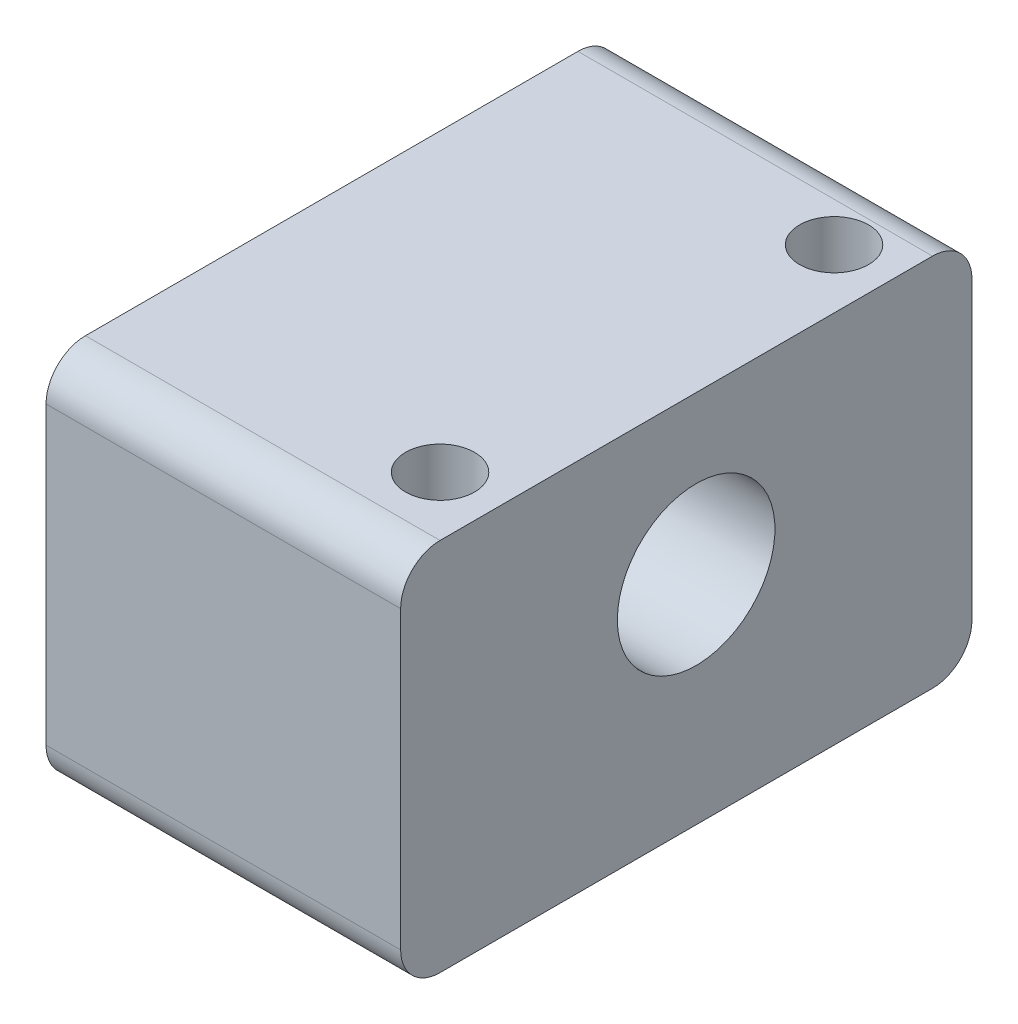
ISO-10303-21;
HEADER;
FILE_DESCRIPTION(('STEP AP214'),'2;1');
FILE_NAME('part.step','',(''),(''),'','','');
FILE_SCHEMA(('AUTOMOTIVE_DESIGN { 1 0 10303 214 1 1 1 1 }'));
ENDSEC;
DATA;
#1=APPLICATION_CONTEXT('core data for automotive mechanical design processes');
#2=APPLICATION_PROTOCOL_DEFINITION('international standard','automotive_design',2000,#1);
#3=PRODUCT_CONTEXT('',#1,'mechanical');
#4=PRODUCT('Part','Part','',(#3));
#5=PRODUCT_RELATED_PRODUCT_CATEGORY('part','',(#4));
#6=PRODUCT_DEFINITION_FORMATION('','',#4);
#7=PRODUCT_DEFINITION_CONTEXT('part definition',#1,'design');
#8=PRODUCT_DEFINITION('design','',#6,#7);
#9=PRODUCT_DEFINITION_SHAPE('','',#8);
#10=(LENGTH_UNIT() NAMED_UNIT(*) SI_UNIT(.MILLI.,.METRE.));
#11=(NAMED_UNIT(*) PLANE_ANGLE_UNIT() SI_UNIT($,.RADIAN.));
#12=(NAMED_UNIT(*) SI_UNIT($,.STERADIAN.) SOLID_ANGLE_UNIT());
#13=UNCERTAINTY_MEASURE_WITH_UNIT(LENGTH_MEASURE(1.E-05),#10,'distance_accuracy_value','');
#14=(GEOMETRIC_REPRESENTATION_CONTEXT(3) GLOBAL_UNCERTAINTY_ASSIGNED_CONTEXT((#13)) GLOBAL_UNIT_ASSIGNED_CONTEXT((#10,
#11,#12)) REPRESENTATION_CONTEXT('',''));
#15=CARTESIAN_POINT('',(0.,0.,0.));
#16=DIRECTION('',(0.,0.,1.));
#17=DIRECTION('',(1.,0.,0.));
#18=AXIS2_PLACEMENT_3D('',#15,#16,#17);
#19=CARTESIAN_POINT('',(0.,19.,0.));
#20=DIRECTION('',(0.,1.,0.));
#21=DIRECTION('',(0.,0.,1.));
#22=AXIS2_PLACEMENT_3D('',#19,#20,#21);
#23=PLANE('',#22);
#24=CARTESIAN_POINT('',(6.,19.,-15.));
#25=DIRECTION('',(0.,1.,0.));
#26=DIRECTION('',(0.,0.,1.));
#27=AXIS2_PLACEMENT_3D('',#24,#25,#26);
#28=CIRCLE('',#27,1.75);
#29=CARTESIAN_POINT('',(6.,19.,-13.25));
#30=VERTEX_POINT('',#29);
#31=EDGE_CURVE('E177',#30,#30,#28,.T.);
#32=ORIENTED_EDGE('',*,*,#31,.F.);
#33=EDGE_LOOP('',(#32));
#34=FACE_BOUND('',#33,.T.);
#35=DIRECTION('',(0.,0.,1.));
#36=VECTOR('',#35,1.);
#37=CARTESIAN_POINT('',(-9.,19.,-39.));
#38=LINE('',#37,#36);
#39=CARTESIAN_POINT('',(-9.,19.,-37.));
#40=VERTEX_POINT('',#39);
#41=CARTESIAN_POINT('',(-9.,19.,-12.));
#42=VERTEX_POINT('',#41);
#43=EDGE_CURVE('E126',#40,#42,#38,.T.);
#44=ORIENTED_EDGE('',*,*,#43,.T.);
#45=DIRECTION('',(1.,0.,0.));
#46=VECTOR('',#45,1.);
#47=CARTESIAN_POINT('',(9.,19.,-12.));
#48=LINE('',#47,#46);
#49=CARTESIAN_POINT('',(9.,19.,-12.));
#50=VERTEX_POINT('',#49);
#51=EDGE_CURVE('E155',#42,#50,#48,.T.);
#52=ORIENTED_EDGE('',*,*,#51,.T.);
#53=DIRECTION('',(0.,0.,-1.));
#54=VECTOR('',#53,1.);
#55=CARTESIAN_POINT('',(9.,19.,-39.));
#56=LINE('',#55,#54);
#57=CARTESIAN_POINT('',(9.,19.,-37.));
#58=VERTEX_POINT('',#57);
#59=EDGE_CURVE('E109',#50,#58,#56,.T.);
#60=ORIENTED_EDGE('',*,*,#59,.T.);
#61=DIRECTION('',(-1.,0.,0.));
#62=VECTOR('',#61,1.);
#63=CARTESIAN_POINT('',(-9.,19.,-37.));
#64=LINE('',#63,#62);
#65=EDGE_CURVE('E152',#58,#40,#64,.T.);
#66=ORIENTED_EDGE('',*,*,#65,.T.);
#67=EDGE_LOOP('',(#44,#52,#60,#66));
#68=FACE_BOUND('',#67,.T.);
#69=CARTESIAN_POINT('',(6.,19.,-35.));
#70=DIRECTION('',(0.,1.,0.));
#71=DIRECTION('',(0.,0.,1.));
#72=AXIS2_PLACEMENT_3D('',#69,#70,#71);
#73=CIRCLE('',#72,1.75);
#74=CARTESIAN_POINT('',(6.,19.,-33.25));
#75=VERTEX_POINT('',#74);
#76=EDGE_CURVE('E239',#75,#75,#73,.T.);
#77=ORIENTED_EDGE('',*,*,#76,.F.);
#78=EDGE_LOOP('',(#77));
#79=FACE_BOUND('',#78,.T.);
#80=ADVANCED_FACE('F38',(#34,#68,#79),#23,.T.);
#81=CARTESIAN_POINT('',(0.,0.,0.));
#82=DIRECTION('',(0.,1.,0.));
#83=DIRECTION('',(0.,0.,1.));
#84=AXIS2_PLACEMENT_3D('',#81,#82,#83);
#85=PLANE('',#84);
#86=DIRECTION('',(0.,0.,-1.));
#87=VECTOR('',#86,1.);
#88=CARTESIAN_POINT('',(9.,0.,-39.));
#89=LINE('',#88,#87);
#90=CARTESIAN_POINT('',(9.,0.,-12.));
#91=VERTEX_POINT('',#90);
#92=CARTESIAN_POINT('',(9.,0.,-37.));
#93=VERTEX_POINT('',#92);
#94=EDGE_CURVE('E175',#91,#93,#89,.T.);
#95=ORIENTED_EDGE('',*,*,#94,.F.);
#96=DIRECTION('',(1.,0.,0.));
#97=VECTOR('',#96,1.);
#98=CARTESIAN_POINT('',(0.,0.,-12.));
#99=LINE('',#98,#97);
#100=CARTESIAN_POINT('',(-9.,0.,-12.));
#101=VERTEX_POINT('',#100);
#102=EDGE_CURVE('E145',#91,#101,#99,.F.);
#103=ORIENTED_EDGE('',*,*,#102,.T.);
#104=DIRECTION('',(0.,0.,1.));
#105=VECTOR('',#104,1.);
#106=CARTESIAN_POINT('',(-9.,0.,-39.));
#107=LINE('',#106,#105);
#108=CARTESIAN_POINT('',(-9.,0.,-37.));
#109=VERTEX_POINT('',#108);
#110=EDGE_CURVE('E171',#109,#101,#107,.T.);
#111=ORIENTED_EDGE('',*,*,#110,.F.);
#112=DIRECTION('',(-1.,0.,0.));
#113=VECTOR('',#112,1.);
#114=CARTESIAN_POINT('',(0.,0.,-37.));
#115=LINE('',#114,#113);
#116=EDGE_CURVE('E143',#109,#93,#115,.F.);
#117=ORIENTED_EDGE('',*,*,#116,.T.);
#118=EDGE_LOOP('',(#95,#103,#111,#117));
#119=FACE_BOUND('',#118,.T.);
#120=CARTESIAN_POINT('',(6.,0.,-15.));
#121=DIRECTION('',(0.,1.,0.));
#122=DIRECTION('',(0.,0.,1.));
#123=AXIS2_PLACEMENT_3D('',#120,#121,#122);
#124=CIRCLE('',#123,1.75);
#125=CARTESIAN_POINT('',(6.,0.,-13.25));
#126=VERTEX_POINT('',#125);
#127=EDGE_CURVE('E244',#126,#126,#124,.T.);
#128=ORIENTED_EDGE('',*,*,#127,.T.);
#129=EDGE_LOOP('',(#128));
#130=FACE_BOUND('',#129,.T.);
#131=CARTESIAN_POINT('',(6.,0.,-35.));
#132=DIRECTION('',(0.,1.,0.));
#133=DIRECTION('',(0.,0.,1.));
#134=AXIS2_PLACEMENT_3D('',#131,#132,#133);
#135=CIRCLE('',#134,1.75);
#136=CARTESIAN_POINT('',(6.,0.,-33.25));
#137=VERTEX_POINT('',#136);
#138=EDGE_CURVE('E236',#137,#137,#135,.T.);
#139=ORIENTED_EDGE('',*,*,#138,.T.);
#140=EDGE_LOOP('',(#139));
#141=FACE_BOUND('',#140,.T.);
#142=ADVANCED_FACE('F183',(#119,#130,#141),#85,.F.);
#143=CARTESIAN_POINT('',(9.,19.,-39.));
#144=DIRECTION('',(-1.,0.,0.));
#145=DIRECTION('',(0.,0.,1.));
#146=AXIS2_PLACEMENT_3D('',#143,#144,#145);
#147=PLANE('',#146);
#148=CARTESIAN_POINT('',(9.,11.,-25.));
#149=DIRECTION('',(-1.,0.,0.));
#150=DIRECTION('',(0.,0.,1.));
#151=AXIS2_PLACEMENT_3D('',#148,#149,#150);
#152=CIRCLE('',#151,4.);
#153=CARTESIAN_POINT('',(9.,11.,-21.));
#154=VERTEX_POINT('',#153);
#155=EDGE_CURVE('E235',#154,#154,#152,.T.);
#156=ORIENTED_EDGE('',*,*,#155,.T.);
#157=EDGE_LOOP('',(#156));
#158=FACE_BOUND('',#157,.T.);
#159=DIRECTION('',(0.,-1.,0.));
#160=VECTOR('',#159,1.);
#161=CARTESIAN_POINT('',(9.,19.,-10.));
#162=LINE('',#161,#160);
#163=CARTESIAN_POINT('',(9.,17.,-10.));
#164=VERTEX_POINT('',#163);
#165=CARTESIAN_POINT('',(9.,2.,-10.));
#166=VERTEX_POINT('',#165);
#167=EDGE_CURVE('E107',#164,#166,#162,.T.);
#168=ORIENTED_EDGE('',*,*,#167,.T.);
#169=CARTESIAN_POINT('',(9.,2.,-12.));
#170=DIRECTION('',(-1.,0.,0.));
#171=DIRECTION('',(0.,0.,1.));
#172=AXIS2_PLACEMENT_3D('',#169,#170,#171);
#173=CIRCLE('',#172,2.);
#174=EDGE_CURVE('E114',#166,#91,#173,.F.);
#175=ORIENTED_EDGE('',*,*,#174,.T.);
#176=ORIENTED_EDGE('',*,*,#94,.T.);
#177=CARTESIAN_POINT('',(9.,2.,-37.));
#178=DIRECTION('',(-1.,0.,0.));
#179=DIRECTION('',(0.,0.,1.));
#180=AXIS2_PLACEMENT_3D('',#177,#178,#179);
#181=CIRCLE('',#180,2.);
#182=CARTESIAN_POINT('',(9.,2.,-39.));
#183=VERTEX_POINT('',#182);
#184=EDGE_CURVE('E115',#93,#183,#181,.F.);
#185=ORIENTED_EDGE('',*,*,#184,.T.);
#186=DIRECTION('',(0.,-1.,0.));
#187=VECTOR('',#186,1.);
#188=CARTESIAN_POINT('',(9.,19.,-39.));
#189=LINE('',#188,#187);
#190=CARTESIAN_POINT('',(9.,17.,-39.));
#191=VERTEX_POINT('',#190);
#192=EDGE_CURVE('E131',#191,#183,#189,.T.);
#193=ORIENTED_EDGE('',*,*,#192,.F.);
#194=CARTESIAN_POINT('',(9.,17.,-37.));
#195=DIRECTION('',(-1.,0.,0.));
#196=DIRECTION('',(0.,0.,1.));
#197=AXIS2_PLACEMENT_3D('',#194,#195,#196);
#198=CIRCLE('',#197,2.);
#199=EDGE_CURVE('E133',#191,#58,#198,.F.);
#200=ORIENTED_EDGE('',*,*,#199,.T.);
#201=ORIENTED_EDGE('',*,*,#59,.F.);
#202=CARTESIAN_POINT('',(9.,17.,-12.));
#203=DIRECTION('',(-1.,0.,0.));
#204=DIRECTION('',(0.,0.,1.));
#205=AXIS2_PLACEMENT_3D('',#202,#203,#204);
#206=CIRCLE('',#205,2.);
#207=EDGE_CURVE('E104',#50,#164,#206,.F.);
#208=ORIENTED_EDGE('',*,*,#207,.T.);
#209=EDGE_LOOP('',(#168,#175,#176,#185,#193,#200,#201,#208));
#210=FACE_BOUND('',#209,.T.);
#211=ADVANCED_FACE('F106',(#158,#210),#147,.F.);
#212=CARTESIAN_POINT('',(-9.,19.,-39.));
#213=DIRECTION('',(0.,0.,1.));
#214=DIRECTION('',(1.,0.,0.));
#215=AXIS2_PLACEMENT_3D('',#212,#213,#214);
#216=PLANE('',#215);
#217=ORIENTED_EDGE('',*,*,#192,.T.);
#218=DIRECTION('',(-1.,0.,0.));
#219=VECTOR('',#218,1.);
#220=CARTESIAN_POINT('',(-9.,2.,-39.));
#221=LINE('',#220,#219);
#222=CARTESIAN_POINT('',(-9.,2.,-39.));
#223=VERTEX_POINT('',#222);
#224=EDGE_CURVE('E11',#183,#223,#221,.T.);
#225=ORIENTED_EDGE('',*,*,#224,.T.);
#226=DIRECTION('',(0.,-1.,0.));
#227=VECTOR('',#226,1.);
#228=CARTESIAN_POINT('',(-9.,19.,-39.));
#229=LINE('',#228,#227);
#230=CARTESIAN_POINT('',(-9.,17.,-39.));
#231=VERTEX_POINT('',#230);
#232=EDGE_CURVE('E136',#231,#223,#229,.T.);
#233=ORIENTED_EDGE('',*,*,#232,.F.);
#234=DIRECTION('',(-1.,0.,0.));
#235=VECTOR('',#234,1.);
#236=CARTESIAN_POINT('',(9.,17.,-39.));
#237=LINE('',#236,#235);
#238=EDGE_CURVE('E46',#231,#191,#237,.F.);
#239=ORIENTED_EDGE('',*,*,#238,.T.);
#240=EDGE_LOOP('',(#217,#225,#233,#239));
#241=FACE_BOUND('',#240,.T.);
#242=ADVANCED_FACE('F159',(#241),#216,.F.);
#243=CARTESIAN_POINT('',(-9.,19.,-39.));
#244=DIRECTION('',(1.,0.,0.));
#245=DIRECTION('',(0.,0.,-1.));
#246=AXIS2_PLACEMENT_3D('',#243,#244,#245);
#247=PLANE('',#246);
#248=CARTESIAN_POINT('',(-9.,11.,-25.));
#249=DIRECTION('',(-1.,0.,0.));
#250=DIRECTION('',(0.,0.,1.));
#251=AXIS2_PLACEMENT_3D('',#248,#249,#250);
#252=CIRCLE('',#251,4.);
#253=CARTESIAN_POINT('',(-9.,11.,-21.));
#254=VERTEX_POINT('',#253);
#255=EDGE_CURVE('E232',#254,#254,#252,.T.);
#256=ORIENTED_EDGE('',*,*,#255,.F.);
#257=EDGE_LOOP('',(#256));
#258=FACE_BOUND('',#257,.T.);
#259=ORIENTED_EDGE('',*,*,#110,.T.);
#260=CARTESIAN_POINT('',(-9.,2.,-12.));
#261=DIRECTION('',(1.,0.,0.));
#262=DIRECTION('',(0.,0.,-1.));
#263=AXIS2_PLACEMENT_3D('',#260,#261,#262);
#264=CIRCLE('',#263,2.);
#265=CARTESIAN_POINT('',(-9.,2.,-10.));
#266=VERTEX_POINT('',#265);
#267=EDGE_CURVE('E150',#101,#266,#264,.F.);
#268=ORIENTED_EDGE('',*,*,#267,.T.);
#269=DIRECTION('',(0.,-1.,0.));
#270=VECTOR('',#269,1.);
#271=CARTESIAN_POINT('',(-9.,19.,-10.));
#272=LINE('',#271,#270);
#273=CARTESIAN_POINT('',(-9.,17.,-10.));
#274=VERTEX_POINT('',#273);
#275=EDGE_CURVE('E125',#274,#266,#272,.T.);
#276=ORIENTED_EDGE('',*,*,#275,.F.);
#277=CARTESIAN_POINT('',(-9.,17.,-12.));
#278=DIRECTION('',(1.,0.,0.));
#279=DIRECTION('',(0.,0.,-1.));
#280=AXIS2_PLACEMENT_3D('',#277,#278,#279);
#281=CIRCLE('',#280,2.);
#282=EDGE_CURVE('E130',#274,#42,#281,.F.);
#283=ORIENTED_EDGE('',*,*,#282,.T.);
#284=ORIENTED_EDGE('',*,*,#43,.F.);
#285=CARTESIAN_POINT('',(-9.,17.,-37.));
#286=DIRECTION('',(1.,0.,0.));
#287=DIRECTION('',(0.,0.,-1.));
#288=AXIS2_PLACEMENT_3D('',#285,#286,#287);
#289=CIRCLE('',#288,2.);
#290=EDGE_CURVE('E60',#40,#231,#289,.F.);
#291=ORIENTED_EDGE('',*,*,#290,.T.);
#292=ORIENTED_EDGE('',*,*,#232,.T.);
#293=CARTESIAN_POINT('',(-9.,2.,-37.));
#294=DIRECTION('',(1.,0.,0.));
#295=DIRECTION('',(0.,0.,-1.));
#296=AXIS2_PLACEMENT_3D('',#293,#294,#295);
#297=CIRCLE('',#296,2.);
#298=EDGE_CURVE('E53',#223,#109,#297,.F.);
#299=ORIENTED_EDGE('',*,*,#298,.T.);
#300=EDGE_LOOP('',(#259,#268,#276,#283,#284,#291,#292,#299));
#301=FACE_BOUND('',#300,.T.);
#302=ADVANCED_FACE('F169',(#258,#301),#247,.F.);
#303=CARTESIAN_POINT('',(-9.,19.,-10.));
#304=DIRECTION('',(0.,0.,-1.));
#305=DIRECTION('',(-1.,0.,0.));
#306=AXIS2_PLACEMENT_3D('',#303,#304,#305);
#307=PLANE('',#306);
#308=ORIENTED_EDGE('',*,*,#275,.T.);
#309=DIRECTION('',(1.,0.,0.));
#310=VECTOR('',#309,1.);
#311=CARTESIAN_POINT('',(-9.,2.,-10.));
#312=LINE('',#311,#310);
#313=EDGE_CURVE('E124',#266,#166,#312,.T.);
#314=ORIENTED_EDGE('',*,*,#313,.T.);
#315=ORIENTED_EDGE('',*,*,#167,.F.);
#316=DIRECTION('',(1.,0.,0.));
#317=VECTOR('',#316,1.);
#318=CARTESIAN_POINT('',(-9.,17.,-10.));
#319=LINE('',#318,#317);
#320=EDGE_CURVE('E121',#164,#274,#319,.F.);
#321=ORIENTED_EDGE('',*,*,#320,.T.);
#322=EDGE_LOOP('',(#308,#314,#315,#321));
#323=FACE_BOUND('',#322,.T.);
#324=ADVANCED_FACE('F120',(#323),#307,.F.);
#325=CARTESIAN_POINT('',(6.,19.,-15.));
#326=DIRECTION('',(0.,-1.,0.));
#327=DIRECTION('',(0.,0.,-1.));
#328=AXIS2_PLACEMENT_3D('',#325,#326,#327);
#329=CYLINDRICAL_SURFACE('',#328,1.75);
#330=ORIENTED_EDGE('',*,*,#31,.T.);
#331=EDGE_LOOP('',(#330));
#332=FACE_BOUND('',#331,.T.);
#333=ORIENTED_EDGE('',*,*,#127,.F.);
#334=EDGE_LOOP('',(#333));
#335=FACE_BOUND('',#334,.T.);
#336=ADVANCED_FACE('F203',(#332,#335),#329,.F.);
#337=CARTESIAN_POINT('',(6.,19.,-35.));
#338=DIRECTION('',(0.,-1.,0.));
#339=DIRECTION('',(0.,0.,-1.));
#340=AXIS2_PLACEMENT_3D('',#337,#338,#339);
#341=CYLINDRICAL_SURFACE('',#340,1.75);
#342=ORIENTED_EDGE('',*,*,#76,.T.);
#343=EDGE_LOOP('',(#342));
#344=FACE_BOUND('',#343,.T.);
#345=ORIENTED_EDGE('',*,*,#138,.F.);
#346=EDGE_LOOP('',(#345));
#347=FACE_BOUND('',#346,.T.);
#348=ADVANCED_FACE('F222',(#344,#347),#341,.F.);
#349=CARTESIAN_POINT('',(11.,11.,-25.));
#350=DIRECTION('',(-1.,0.,0.));
#351=DIRECTION('',(0.,0.,1.));
#352=AXIS2_PLACEMENT_3D('',#349,#350,#351);
#353=CYLINDRICAL_SURFACE('',#352,4.);
#354=ORIENTED_EDGE('',*,*,#255,.T.);
#355=EDGE_LOOP('',(#354));
#356=FACE_BOUND('',#355,.T.);
#357=ORIENTED_EDGE('',*,*,#155,.F.);
#358=EDGE_LOOP('',(#357));
#359=FACE_BOUND('',#358,.T.);
#360=ADVANCED_FACE('F217',(#356,#359),#353,.F.);
#361=CARTESIAN_POINT('',(-9.,2.,-12.));
#362=DIRECTION('',(1.,0.,0.));
#363=DIRECTION('',(0.,0.,-1.));
#364=AXIS2_PLACEMENT_3D('',#361,#362,#363);
#365=CYLINDRICAL_SURFACE('',#364,2.);
#366=ORIENTED_EDGE('',*,*,#267,.F.);
#367=ORIENTED_EDGE('',*,*,#102,.F.);
#368=ORIENTED_EDGE('',*,*,#174,.F.);
#369=ORIENTED_EDGE('',*,*,#313,.F.);
#370=EDGE_LOOP('',(#366,#367,#368,#369));
#371=FACE_BOUND('',#370,.T.);
#372=ADVANCED_FACE('F192',(#371),#365,.T.);
#373=CARTESIAN_POINT('',(0.,17.,-12.));
#374=DIRECTION('',(-1.,0.,0.));
#375=DIRECTION('',(0.,0.,1.));
#376=AXIS2_PLACEMENT_3D('',#373,#374,#375);
#377=CYLINDRICAL_SURFACE('',#376,2.);
#378=ORIENTED_EDGE('',*,*,#282,.F.);
#379=ORIENTED_EDGE('',*,*,#320,.F.);
#380=ORIENTED_EDGE('',*,*,#207,.F.);
#381=ORIENTED_EDGE('',*,*,#51,.F.);
#382=EDGE_LOOP('',(#378,#379,#380,#381));
#383=FACE_BOUND('',#382,.T.);
#384=ADVANCED_FACE('F129',(#383),#377,.T.);
#385=CARTESIAN_POINT('',(-9.,2.,-37.));
#386=DIRECTION('',(-1.,0.,0.));
#387=DIRECTION('',(0.,0.,1.));
#388=AXIS2_PLACEMENT_3D('',#385,#386,#387);
#389=CYLINDRICAL_SURFACE('',#388,2.);
#390=ORIENTED_EDGE('',*,*,#184,.F.);
#391=ORIENTED_EDGE('',*,*,#116,.F.);
#392=ORIENTED_EDGE('',*,*,#298,.F.);
#393=ORIENTED_EDGE('',*,*,#224,.F.);
#394=EDGE_LOOP('',(#390,#391,#392,#393));
#395=FACE_BOUND('',#394,.T.);
#396=ADVANCED_FACE('F186',(#395),#389,.T.);
#397=CARTESIAN_POINT('',(0.,17.,-37.));
#398=DIRECTION('',(1.,0.,0.));
#399=DIRECTION('',(0.,0.,-1.));
#400=AXIS2_PLACEMENT_3D('',#397,#398,#399);
#401=CYLINDRICAL_SURFACE('',#400,2.);
#402=ORIENTED_EDGE('',*,*,#199,.F.);
#403=ORIENTED_EDGE('',*,*,#238,.F.);
#404=ORIENTED_EDGE('',*,*,#290,.F.);
#405=ORIENTED_EDGE('',*,*,#65,.F.);
#406=EDGE_LOOP('',(#402,#403,#404,#405));
#407=FACE_BOUND('',#406,.T.);
#408=ADVANCED_FACE('F40',(#407),#401,.T.);
#409=CLOSED_SHELL('',(#80,#142,#211,#242,#302,#324,#336,#348,#360,#372,#384,#396,#408));
#410=MANIFOLD_SOLID_BREP('B2',#409);
#411=ADVANCED_BREP_SHAPE_REPRESENTATION('',(#18,#410),#14);
#412=SHAPE_DEFINITION_REPRESENTATION(#9,#411);
ENDSEC;
END-ISO-10303-21;
